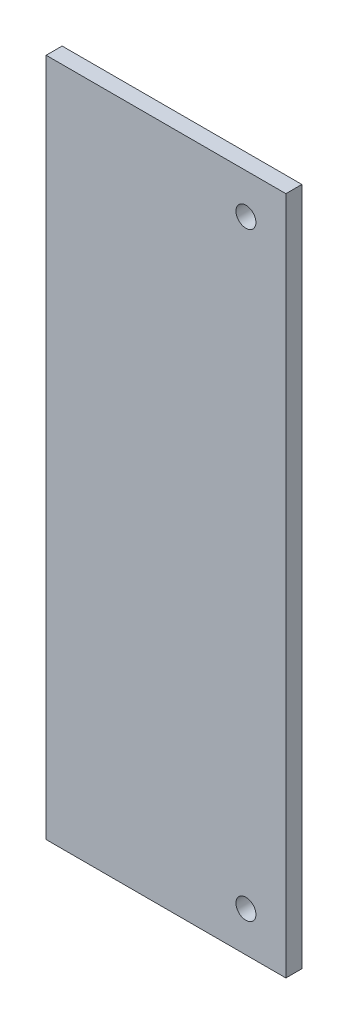
ISO-10303-21;
HEADER;
FILE_DESCRIPTION(('STEP AP214'),'2;1');
FILE_NAME('part.step','',(''),(''),'','','');
FILE_SCHEMA(('AUTOMOTIVE_DESIGN { 1 0 10303 214 1 1 1 1 }'));
ENDSEC;
DATA;
#1=APPLICATION_CONTEXT('core data for automotive mechanical design processes');
#2=APPLICATION_PROTOCOL_DEFINITION('international standard','automotive_design',2000,#1);
#3=PRODUCT_CONTEXT('',#1,'mechanical');
#4=PRODUCT('Part','Part','',(#3));
#5=PRODUCT_RELATED_PRODUCT_CATEGORY('part','',(#4));
#6=PRODUCT_DEFINITION_FORMATION('','',#4);
#7=PRODUCT_DEFINITION_CONTEXT('part definition',#1,'design');
#8=PRODUCT_DEFINITION('design','',#6,#7);
#9=PRODUCT_DEFINITION_SHAPE('','',#8);
#10=(LENGTH_UNIT() NAMED_UNIT(*) SI_UNIT(.MILLI.,.METRE.));
#11=(NAMED_UNIT(*) PLANE_ANGLE_UNIT() SI_UNIT($,.RADIAN.));
#12=(NAMED_UNIT(*) SI_UNIT($,.STERADIAN.) SOLID_ANGLE_UNIT());
#13=UNCERTAINTY_MEASURE_WITH_UNIT(LENGTH_MEASURE(1.E-05),#10,'distance_accuracy_value','');
#14=(GEOMETRIC_REPRESENTATION_CONTEXT(3) GLOBAL_UNCERTAINTY_ASSIGNED_CONTEXT((#13)) GLOBAL_UNIT_ASSIGNED_CONTEXT((#10,
#11,#12)) REPRESENTATION_CONTEXT('',''));
#15=CARTESIAN_POINT('',(0.,0.,0.));
#16=DIRECTION('',(0.,0.,1.));
#17=DIRECTION('',(1.,0.,0.));
#18=AXIS2_PLACEMENT_3D('',#15,#16,#17);
#19=CARTESIAN_POINT('',(-60.,170.,4.));
#20=DIRECTION('',(1.,0.,0.));
#21=DIRECTION('',(0.,1.,0.));
#22=AXIS2_PLACEMENT_3D('',#19,#20,#21);
#23=PLANE('',#22);
#24=DIRECTION('',(0.,-1.,0.));
#25=VECTOR('',#24,1.);
#26=CARTESIAN_POINT('',(-60.,170.,0.));
#27=LINE('',#26,#25);
#28=CARTESIAN_POINT('',(-60.,170.,0.));
#29=VERTEX_POINT('',#28);
#30=CARTESIAN_POINT('',(-60.,0.,0.));
#31=VERTEX_POINT('',#30);
#32=EDGE_CURVE('E102',#29,#31,#27,.T.);
#33=ORIENTED_EDGE('',*,*,#32,.T.);
#34=DIRECTION('',(0.,0.,-1.));
#35=VECTOR('',#34,1.);
#36=CARTESIAN_POINT('',(-60.,0.,4.));
#37=LINE('',#36,#35);
#38=CARTESIAN_POINT('',(-60.,0.,4.));
#39=VERTEX_POINT('',#38);
#40=EDGE_CURVE('E11',#39,#31,#37,.T.);
#41=ORIENTED_EDGE('',*,*,#40,.F.);
#42=DIRECTION('',(0.,-1.,0.));
#43=VECTOR('',#42,1.);
#44=CARTESIAN_POINT('',(-60.,170.,4.));
#45=LINE('',#44,#43);
#46=CARTESIAN_POINT('',(-60.,170.,4.));
#47=VERTEX_POINT('',#46);
#48=EDGE_CURVE('E90',#47,#39,#45,.T.);
#49=ORIENTED_EDGE('',*,*,#48,.F.);
#50=DIRECTION('',(0.,0.,-1.));
#51=VECTOR('',#50,1.);
#52=CARTESIAN_POINT('',(-60.,170.,4.));
#53=LINE('',#52,#51);
#54=EDGE_CURVE('E98',#47,#29,#53,.T.);
#55=ORIENTED_EDGE('',*,*,#54,.T.);
#56=EDGE_LOOP('',(#33,#41,#49,#55));
#57=FACE_BOUND('',#56,.T.);
#58=ADVANCED_FACE('F39',(#57),#23,.F.);
#59=CARTESIAN_POINT('',(-60.,0.,4.));
#60=DIRECTION('',(0.,1.,0.));
#61=DIRECTION('',(0.,0.,1.));
#62=AXIS2_PLACEMENT_3D('',#59,#60,#61);
#63=PLANE('',#62);
#64=DIRECTION('',(1.,0.,0.));
#65=VECTOR('',#64,1.);
#66=CARTESIAN_POINT('',(-60.,0.,0.));
#67=LINE('',#66,#65);
#68=CARTESIAN_POINT('',(0.,0.,0.));
#69=VERTEX_POINT('',#68);
#70=EDGE_CURVE('E94',#31,#69,#67,.T.);
#71=ORIENTED_EDGE('',*,*,#70,.T.);
#72=DIRECTION('',(0.,0.,-1.));
#73=VECTOR('',#72,1.);
#74=CARTESIAN_POINT('',(0.,0.,4.));
#75=LINE('',#74,#73);
#76=CARTESIAN_POINT('',(0.,0.,4.));
#77=VERTEX_POINT('',#76);
#78=EDGE_CURVE('E47',#77,#69,#75,.T.);
#79=ORIENTED_EDGE('',*,*,#78,.F.);
#80=DIRECTION('',(1.,0.,0.));
#81=VECTOR('',#80,1.);
#82=CARTESIAN_POINT('',(-60.,0.,4.));
#83=LINE('',#82,#81);
#84=EDGE_CURVE('E85',#39,#77,#83,.T.);
#85=ORIENTED_EDGE('',*,*,#84,.F.);
#86=ORIENTED_EDGE('',*,*,#40,.T.);
#87=EDGE_LOOP('',(#71,#79,#85,#86));
#88=FACE_BOUND('',#87,.T.);
#89=ADVANCED_FACE('F93',(#88),#63,.F.);
#90=CARTESIAN_POINT('',(0.,170.,4.));
#91=DIRECTION('',(-1.,0.,0.));
#92=DIRECTION('',(0.,-1.,0.));
#93=AXIS2_PLACEMENT_3D('',#90,#91,#92);
#94=PLANE('',#93);
#95=DIRECTION('',(0.,1.,0.));
#96=VECTOR('',#95,1.);
#97=CARTESIAN_POINT('',(0.,170.,0.));
#98=LINE('',#97,#96);
#99=CARTESIAN_POINT('',(0.,170.,0.));
#100=VERTEX_POINT('',#99);
#101=EDGE_CURVE('E72',#69,#100,#98,.T.);
#102=ORIENTED_EDGE('',*,*,#101,.T.);
#103=DIRECTION('',(0.,0.,-1.));
#104=VECTOR('',#103,1.);
#105=CARTESIAN_POINT('',(0.,170.,4.));
#106=LINE('',#105,#104);
#107=CARTESIAN_POINT('',(0.,170.,4.));
#108=VERTEX_POINT('',#107);
#109=EDGE_CURVE('E95',#108,#100,#106,.T.);
#110=ORIENTED_EDGE('',*,*,#109,.F.);
#111=DIRECTION('',(0.,1.,0.));
#112=VECTOR('',#111,1.);
#113=CARTESIAN_POINT('',(0.,170.,4.));
#114=LINE('',#113,#112);
#115=EDGE_CURVE('E88',#77,#108,#114,.T.);
#116=ORIENTED_EDGE('',*,*,#115,.F.);
#117=ORIENTED_EDGE('',*,*,#78,.T.);
#118=EDGE_LOOP('',(#102,#110,#116,#117));
#119=FACE_BOUND('',#118,.T.);
#120=ADVANCED_FACE('F96',(#119),#94,.F.);
#121=CARTESIAN_POINT('',(-60.,170.,4.));
#122=DIRECTION('',(0.,-1.,0.));
#123=DIRECTION('',(0.,0.,-1.));
#124=AXIS2_PLACEMENT_3D('',#121,#122,#123);
#125=PLANE('',#124);
#126=DIRECTION('',(-1.,0.,0.));
#127=VECTOR('',#126,1.);
#128=CARTESIAN_POINT('',(-60.,170.,0.));
#129=LINE('',#128,#127);
#130=EDGE_CURVE('E78',#100,#29,#129,.T.);
#131=ORIENTED_EDGE('',*,*,#130,.T.);
#132=ORIENTED_EDGE('',*,*,#54,.F.);
#133=DIRECTION('',(-1.,0.,0.));
#134=VECTOR('',#133,1.);
#135=CARTESIAN_POINT('',(-60.,170.,4.));
#136=LINE('',#135,#134);
#137=EDGE_CURVE('E55',#108,#47,#136,.T.);
#138=ORIENTED_EDGE('',*,*,#137,.F.);
#139=ORIENTED_EDGE('',*,*,#109,.T.);
#140=EDGE_LOOP('',(#131,#132,#138,#139));
#141=FACE_BOUND('',#140,.T.);
#142=ADVANCED_FACE('F110',(#141),#125,.F.);
#143=CARTESIAN_POINT('',(0.,0.,4.));
#144=DIRECTION('',(0.,0.,1.));
#145=DIRECTION('',(1.,0.,0.));
#146=AXIS2_PLACEMENT_3D('',#143,#144,#145);
#147=PLANE('',#146);
#148=CARTESIAN_POINT('',(-9.99999999999999,160.,4.));
#149=DIRECTION('',(0.,0.,1.));
#150=DIRECTION('',(1.,0.,0.));
#151=AXIS2_PLACEMENT_3D('',#148,#149,#150);
#152=CIRCLE('',#151,2.5);
#153=CARTESIAN_POINT('',(-7.49999999999999,160.,4.));
#154=VERTEX_POINT('',#153);
#155=EDGE_CURVE('E122',#154,#154,#152,.F.);
#156=ORIENTED_EDGE('',*,*,#155,.T.);
#157=EDGE_LOOP('',(#156));
#158=FACE_BOUND('',#157,.T.);
#159=CARTESIAN_POINT('',(-10.,10.,4.));
#160=DIRECTION('',(0.,0.,1.));
#161=DIRECTION('',(1.,0.,0.));
#162=AXIS2_PLACEMENT_3D('',#159,#160,#161);
#163=CIRCLE('',#162,2.5);
#164=CARTESIAN_POINT('',(-7.5,10.,4.));
#165=VERTEX_POINT('',#164);
#166=EDGE_CURVE('E116',#165,#165,#163,.F.);
#167=ORIENTED_EDGE('',*,*,#166,.T.);
#168=EDGE_LOOP('',(#167));
#169=FACE_BOUND('',#168,.T.);
#170=ORIENTED_EDGE('',*,*,#48,.T.);
#171=ORIENTED_EDGE('',*,*,#84,.T.);
#172=ORIENTED_EDGE('',*,*,#115,.T.);
#173=ORIENTED_EDGE('',*,*,#137,.T.);
#174=EDGE_LOOP('',(#170,#171,#172,#173));
#175=FACE_BOUND('',#174,.T.);
#176=ADVANCED_FACE('F86',(#158,#169,#175),#147,.T.);
#177=CARTESIAN_POINT('',(0.,0.,0.));
#178=DIRECTION('',(0.,0.,1.));
#179=DIRECTION('',(1.,0.,0.));
#180=AXIS2_PLACEMENT_3D('',#177,#178,#179);
#181=PLANE('',#180);
#182=CARTESIAN_POINT('',(-9.99999999999999,160.,0.));
#183=DIRECTION('',(0.,0.,-1.));
#184=DIRECTION('',(-1.,0.,0.));
#185=AXIS2_PLACEMENT_3D('',#182,#183,#184);
#186=CIRCLE('',#185,2.5);
#187=CARTESIAN_POINT('',(-12.5,160.,0.));
#188=VERTEX_POINT('',#187);
#189=EDGE_CURVE('E119',#188,#188,#186,.T.);
#190=ORIENTED_EDGE('',*,*,#189,.F.);
#191=EDGE_LOOP('',(#190));
#192=FACE_BOUND('',#191,.T.);
#193=CARTESIAN_POINT('',(-10.,10.,0.));
#194=DIRECTION('',(0.,0.,-1.));
#195=DIRECTION('',(-1.,0.,0.));
#196=AXIS2_PLACEMENT_3D('',#193,#194,#195);
#197=CIRCLE('',#196,2.5);
#198=CARTESIAN_POINT('',(-12.5,10.,0.));
#199=VERTEX_POINT('',#198);
#200=EDGE_CURVE('E105',#199,#199,#197,.T.);
#201=ORIENTED_EDGE('',*,*,#200,.F.);
#202=EDGE_LOOP('',(#201));
#203=FACE_BOUND('',#202,.T.);
#204=ORIENTED_EDGE('',*,*,#32,.F.);
#205=ORIENTED_EDGE('',*,*,#130,.F.);
#206=ORIENTED_EDGE('',*,*,#101,.F.);
#207=ORIENTED_EDGE('',*,*,#70,.F.);
#208=EDGE_LOOP('',(#204,#205,#206,#207));
#209=FACE_BOUND('',#208,.T.);
#210=ADVANCED_FACE('F113',(#192,#203,#209),#181,.F.);
#211=CARTESIAN_POINT('',(-10.,10.,4.001));
#212=DIRECTION('',(0.,0.,-1.));
#213=DIRECTION('',(-1.,0.,0.));
#214=AXIS2_PLACEMENT_3D('',#211,#212,#213);
#215=CYLINDRICAL_SURFACE('',#214,2.5);
#216=ORIENTED_EDGE('',*,*,#166,.F.);
#217=EDGE_LOOP('',(#216));
#218=FACE_BOUND('',#217,.T.);
#219=ORIENTED_EDGE('',*,*,#200,.T.);
#220=EDGE_LOOP('',(#219));
#221=FACE_BOUND('',#220,.T.);
#222=ADVANCED_FACE('F132',(#218,#221),#215,.F.);
#223=CARTESIAN_POINT('',(-9.99999999999999,160.,4.001));
#224=DIRECTION('',(0.,0.,-1.));
#225=DIRECTION('',(-1.,0.,0.));
#226=AXIS2_PLACEMENT_3D('',#223,#224,#225);
#227=CYLINDRICAL_SURFACE('',#226,2.5);
#228=ORIENTED_EDGE('',*,*,#155,.F.);
#229=EDGE_LOOP('',(#228));
#230=FACE_BOUND('',#229,.T.);
#231=ORIENTED_EDGE('',*,*,#189,.T.);
#232=EDGE_LOOP('',(#231));
#233=FACE_BOUND('',#232,.T.);
#234=ADVANCED_FACE('F128',(#230,#233),#227,.F.);
#235=CLOSED_SHELL('',(#58,#89,#120,#142,#176,#210,#222,#234));
#236=MANIFOLD_SOLID_BREP('B2',#235);
#237=ADVANCED_BREP_SHAPE_REPRESENTATION('',(#18,#236),#14);
#238=SHAPE_DEFINITION_REPRESENTATION(#9,#237);
ENDSEC;
END-ISO-10303-21;
